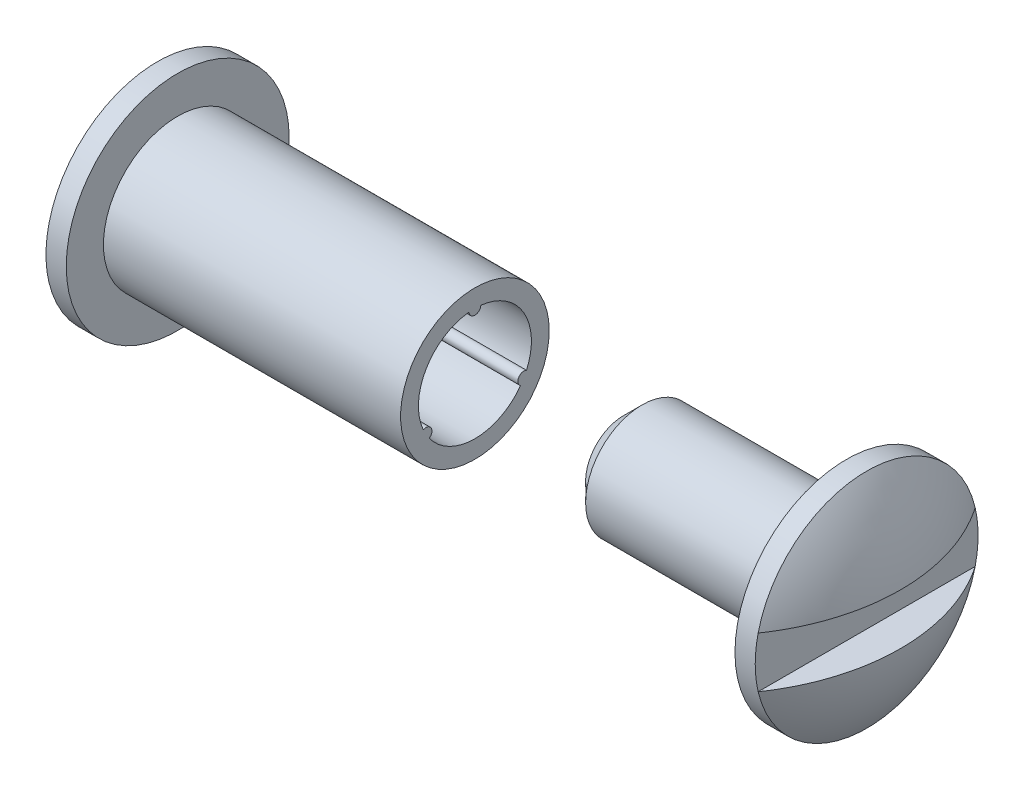
ISO-10303-21;
HEADER;
FILE_DESCRIPTION(('STEP AP214'),'2;1');
FILE_NAME('part.step','',(''),(''),'','','');
FILE_SCHEMA(('AUTOMOTIVE_DESIGN { 1 0 10303 214 1 1 1 1 }'));
ENDSEC;
DATA;
#1=APPLICATION_CONTEXT('core data for automotive mechanical design processes');
#2=APPLICATION_PROTOCOL_DEFINITION('international standard','automotive_design',2000,#1);
#3=PRODUCT_CONTEXT('',#1,'mechanical');
#4=PRODUCT('Part','Part','',(#3));
#5=PRODUCT_RELATED_PRODUCT_CATEGORY('part','',(#4));
#6=PRODUCT_DEFINITION_FORMATION('','',#4);
#7=PRODUCT_DEFINITION_CONTEXT('part definition',#1,'design');
#8=PRODUCT_DEFINITION('design','',#6,#7);
#9=PRODUCT_DEFINITION_SHAPE('','',#8);
#10=(LENGTH_UNIT() NAMED_UNIT(*) SI_UNIT(.MILLI.,.METRE.));
#11=(NAMED_UNIT(*) PLANE_ANGLE_UNIT() SI_UNIT($,.RADIAN.));
#12=(NAMED_UNIT(*) SI_UNIT($,.STERADIAN.) SOLID_ANGLE_UNIT());
#13=UNCERTAINTY_MEASURE_WITH_UNIT(LENGTH_MEASURE(1.E-05),#10,'distance_accuracy_value','');
#14=(GEOMETRIC_REPRESENTATION_CONTEXT(3) GLOBAL_UNCERTAINTY_ASSIGNED_CONTEXT((#13)) GLOBAL_UNIT_ASSIGNED_CONTEXT((#10,
#11,#12)) REPRESENTATION_CONTEXT('',''));
#15=CARTESIAN_POINT('',(0.,0.,0.));
#16=DIRECTION('',(0.,0.,1.));
#17=DIRECTION('',(1.,0.,0.));
#18=AXIS2_PLACEMENT_3D('',#15,#16,#17);
#19=CARTESIAN_POINT('',(9.525,0.,0.));
#20=DIRECTION('',(1.,0.,0.));
#21=DIRECTION('',(0.,0.,-1.));
#22=AXIS2_PLACEMENT_3D('',#19,#20,#21);
#23=PLANE('',#22);
#24=CARTESIAN_POINT('',(9.525,0.,0.));
#25=DIRECTION('',(-1.,0.,0.));
#26=DIRECTION('',(0.,0.,1.));
#27=AXIS2_PLACEMENT_3D('',#24,#25,#26);
#28=CIRCLE('',#27,4.7625);
#29=CARTESIAN_POINT('',(9.525,0.,4.7625));
#30=VERTEX_POINT('',#29);
#31=EDGE_CURVE('E93',#30,#30,#28,.T.);
#32=ORIENTED_EDGE('',*,*,#31,.T.);
#33=EDGE_LOOP('',(#32));
#34=FACE_BOUND('',#33,.T.);
#35=CARTESIAN_POINT('',(9.525,0.,0.));
#36=DIRECTION('',(1.,0.,0.));
#37=DIRECTION('',(0.,0.,-1.));
#38=AXIS2_PLACEMENT_3D('',#35,#36,#37);
#39=CIRCLE('',#38,2.413);
#40=CARTESIAN_POINT('',(9.525,0.,2.413));
#41=VERTEX_POINT('',#40);
#42=EDGE_CURVE('E12',#41,#41,#39,.F.);
#43=ORIENTED_EDGE('',*,*,#42,.F.);
#44=EDGE_LOOP('',(#43));
#45=FACE_BOUND('',#44,.T.);
#46=ADVANCED_FACE('F53',(#34,#45),#23,.F.);
#47=CARTESIAN_POINT('',(3.65979150646579,0.,0.));
#48=DIRECTION('',(-1.,0.,0.));
#49=DIRECTION('',(0.,1.,0.));
#50=AXIS2_PLACEMENT_3D('',#47,#48,#49);
#51=SPHERICAL_SURFACE('',#50,8.24518849353421);
#52=CARTESIAN_POINT('',(10.3904472727273,0.,0.));
#53=DIRECTION('',(-1.,0.,0.));
#54=DIRECTION('',(0.,0.,1.));
#55=AXIS2_PLACEMENT_3D('',#52,#53,#54);
#56=CIRCLE('',#55,4.7625);
#57=CARTESIAN_POINT('',(10.3904472727273,1.08585,4.63706114122943));
#58=VERTEX_POINT('',#57);
#59=CARTESIAN_POINT('',(10.3904472727273,1.08585,-4.63706114122943));
#60=VERTEX_POINT('',#59);
#61=EDGE_CURVE('E87',#58,#60,#56,.T.);
#62=ORIENTED_EDGE('',*,*,#61,.F.);
#63=CARTESIAN_POINT('',(3.65979150646579,1.08585,0.));
#64=DIRECTION('',(0.,1.,0.));
#65=DIRECTION('',(0.,0.,1.));
#66=AXIS2_PLACEMENT_3D('',#63,#64,#65);
#67=CIRCLE('',#66,8.17337525575628);
#68=EDGE_CURVE('E61',#58,#60,#67,.T.);
#69=ORIENTED_EDGE('',*,*,#68,.T.);
#70=EDGE_LOOP('',(#62,#69));
#71=FACE_BOUND('',#70,.T.);
#72=ADVANCED_FACE('F96',(#71),#51,.T.);
#73=CARTESIAN_POINT('',(10.3904472727273,-1.08585,-4.63706114122943));
#74=VERTEX_POINT('',#73);
#75=CARTESIAN_POINT('',(10.3904472727273,-1.08585,4.63706114122943));
#76=VERTEX_POINT('',#75);
#77=EDGE_CURVE('E88',#74,#76,#56,.T.);
#78=ORIENTED_EDGE('',*,*,#77,.F.);
#79=CARTESIAN_POINT('',(3.65979150646579,-1.08585,0.));
#80=DIRECTION('',(0.,-1.,0.));
#81=DIRECTION('',(0.,0.,-1.));
#82=AXIS2_PLACEMENT_3D('',#79,#80,#81);
#83=CIRCLE('',#82,8.17337525575628);
#84=EDGE_CURVE('E97',#74,#76,#83,.T.);
#85=ORIENTED_EDGE('',*,*,#84,.T.);
#86=EDGE_LOOP('',(#78,#85));
#87=FACE_BOUND('',#86,.T.);
#88=ADVANCED_FACE('F55',(#87),#51,.T.);
#89=CARTESIAN_POINT('',(9.525,0.,0.));
#90=DIRECTION('',(-1.,0.,0.));
#91=DIRECTION('',(0.,0.,1.));
#92=AXIS2_PLACEMENT_3D('',#89,#90,#91);
#93=CYLINDRICAL_SURFACE('',#92,4.7625);
#94=ORIENTED_EDGE('',*,*,#31,.F.);
#95=EDGE_LOOP('',(#94));
#96=FACE_BOUND('',#95,.T.);
#97=EDGE_CURVE('E75',#76,#58,#56,.T.);
#98=ORIENTED_EDGE('',*,*,#97,.T.);
#99=ORIENTED_EDGE('',*,*,#61,.T.);
#100=EDGE_CURVE('E68',#60,#74,#56,.T.);
#101=ORIENTED_EDGE('',*,*,#100,.T.);
#102=ORIENTED_EDGE('',*,*,#77,.T.);
#103=EDGE_LOOP('',(#98,#99,#101,#102));
#104=FACE_BOUND('',#103,.T.);
#105=ADVANCED_FACE('F98',(#96,#104),#93,.T.);
#106=CARTESIAN_POINT('',(10.3904472727273,1.08585,4.7625));
#107=DIRECTION('',(0.,1.,0.));
#108=DIRECTION('',(0.,0.,1.));
#109=AXIS2_PLACEMENT_3D('',#106,#107,#108);
#110=PLANE('',#109);
#111=DIRECTION('',(0.,0.,1.));
#112=VECTOR('',#111,1.);
#113=CARTESIAN_POINT('',(10.3904472727273,1.08585,4.7625));
#114=LINE('',#113,#112);
#115=EDGE_CURVE('E83',#60,#58,#114,.T.);
#116=ORIENTED_EDGE('',*,*,#115,.F.);
#117=ORIENTED_EDGE('',*,*,#68,.F.);
#118=EDGE_LOOP('',(#116,#117));
#119=FACE_BOUND('',#118,.T.);
#120=ADVANCED_FACE('F92',(#119),#110,.F.);
#121=CARTESIAN_POINT('',(10.3904472727273,-1.08585,4.7625));
#122=DIRECTION('',(0.,-1.,0.));
#123=DIRECTION('',(0.,0.,-1.));
#124=AXIS2_PLACEMENT_3D('',#121,#122,#123);
#125=PLANE('',#124);
#126=DIRECTION('',(0.,0.,-1.));
#127=VECTOR('',#126,1.);
#128=CARTESIAN_POINT('',(10.3904472727273,-1.08585,4.7625));
#129=LINE('',#128,#127);
#130=EDGE_CURVE('E85',#76,#74,#129,.T.);
#131=ORIENTED_EDGE('',*,*,#130,.F.);
#132=ORIENTED_EDGE('',*,*,#84,.F.);
#133=EDGE_LOOP('',(#131,#132));
#134=FACE_BOUND('',#133,.T.);
#135=ADVANCED_FACE('F115',(#134),#125,.F.);
#136=CARTESIAN_POINT('',(10.3904472727273,-1.08585,4.7625));
#137=DIRECTION('',(1.,0.,0.));
#138=DIRECTION('',(0.,0.,-1.));
#139=AXIS2_PLACEMENT_3D('',#136,#137,#138);
#140=PLANE('',#139);
#141=ORIENTED_EDGE('',*,*,#97,.F.);
#142=ORIENTED_EDGE('',*,*,#130,.T.);
#143=ORIENTED_EDGE('',*,*,#100,.F.);
#144=ORIENTED_EDGE('',*,*,#115,.T.);
#145=EDGE_LOOP('',(#141,#142,#143,#144));
#146=FACE_BOUND('',#145,.T.);
#147=ADVANCED_FACE('F82',(#146),#140,.T.);
#148=CARTESIAN_POINT('',(9.525,0.,0.));
#149=DIRECTION('',(-1.,0.,0.));
#150=DIRECTION('',(0.,0.,1.));
#151=AXIS2_PLACEMENT_3D('',#148,#149,#150);
#152=CYLINDRICAL_SURFACE('',#151,2.413);
#153=CARTESIAN_POINT('',(0.793750000000006,0.,0.));
#154=DIRECTION('',(1.,0.,0.));
#155=DIRECTION('',(0.,0.,-1.));
#156=AXIS2_PLACEMENT_3D('',#153,#154,#155);
#157=CIRCLE('',#156,2.413);
#158=CARTESIAN_POINT('',(0.793750000000006,0.,2.413));
#159=VERTEX_POINT('',#158);
#160=EDGE_CURVE('E143',#159,#159,#157,.T.);
#161=CARTESIAN_POINT('',(0.793750000000006,0.,2.413));
#162=CARTESIAN_POINT('',(0.884700520833339,0.,2.413));
#163=CARTESIAN_POINT('',(0.975651041666672,0.,2.413));
#164=CARTESIAN_POINT('',(1.15755208333334,0.,2.413));
#165=CARTESIAN_POINT('',(1.24850260416667,0.,2.413));
#166=CARTESIAN_POINT('',(1.43040364583334,0.,2.413));
#167=CARTESIAN_POINT('',(1.52135416666667,0.,2.413));
#168=CARTESIAN_POINT('',(1.70325520833334,0.,2.413));
#169=CARTESIAN_POINT('',(1.79420572916667,0.,2.413));
#170=CARTESIAN_POINT('',(1.97610677083334,0.,2.413));
#171=CARTESIAN_POINT('',(2.06705729166667,0.,2.413));
#172=CARTESIAN_POINT('',(2.24895833333334,0.,2.413));
#173=CARTESIAN_POINT('',(2.33990885416667,0.,2.413));
#174=CARTESIAN_POINT('',(2.52180989583334,0.,2.413));
#175=CARTESIAN_POINT('',(2.61276041666667,0.,2.413));
#176=CARTESIAN_POINT('',(2.79466145833334,0.,2.413));
#177=CARTESIAN_POINT('',(2.88561197916667,0.,2.413));
#178=CARTESIAN_POINT('',(3.06751302083334,0.,2.413));
#179=CARTESIAN_POINT('',(3.15846354166667,0.,2.413));
#180=CARTESIAN_POINT('',(3.34036458333334,0.,2.413));
#181=CARTESIAN_POINT('',(3.43131510416667,0.,2.413));
#182=CARTESIAN_POINT('',(3.61321614583334,0.,2.413));
#183=CARTESIAN_POINT('',(3.70416666666667,0.,2.413));
#184=CARTESIAN_POINT('',(3.88606770833334,0.,2.413));
#185=CARTESIAN_POINT('',(3.97701822916667,0.,2.413));
#186=CARTESIAN_POINT('',(4.15891927083334,0.,2.413));
#187=CARTESIAN_POINT('',(4.24986979166667,0.,2.413));
#188=CARTESIAN_POINT('',(4.43177083333334,0.,2.413));
#189=CARTESIAN_POINT('',(4.52272135416667,0.,2.413));
#190=CARTESIAN_POINT('',(4.70462239583334,0.,2.413));
#191=CARTESIAN_POINT('',(4.79557291666667,0.,2.413));
#192=CARTESIAN_POINT('',(4.97747395833334,0.,2.413));
#193=CARTESIAN_POINT('',(5.06842447916667,0.,2.413));
#194=CARTESIAN_POINT('',(5.25032552083334,0.,2.413));
#195=CARTESIAN_POINT('',(5.34127604166667,0.,2.413));
#196=CARTESIAN_POINT('',(5.52317708333334,0.,2.413));
#197=CARTESIAN_POINT('',(5.61412760416667,0.,2.413));
#198=CARTESIAN_POINT('',(5.79602864583334,0.,2.413));
#199=CARTESIAN_POINT('',(5.88697916666667,0.,2.413));
#200=CARTESIAN_POINT('',(6.06888020833333,0.,2.413));
#201=CARTESIAN_POINT('',(6.15983072916667,0.,2.413));
#202=CARTESIAN_POINT('',(6.34173177083334,0.,2.413));
#203=CARTESIAN_POINT('',(6.43268229166667,0.,2.413));
#204=CARTESIAN_POINT('',(6.61458333333333,0.,2.413));
#205=CARTESIAN_POINT('',(6.70553385416667,0.,2.413));
#206=CARTESIAN_POINT('',(6.88743489583334,0.,2.413));
#207=CARTESIAN_POINT('',(6.97838541666667,0.,2.413));
#208=CARTESIAN_POINT('',(7.16028645833333,0.,2.413));
#209=CARTESIAN_POINT('',(7.25123697916667,0.,2.413));
#210=CARTESIAN_POINT('',(7.43313802083333,0.,2.413));
#211=CARTESIAN_POINT('',(7.52408854166667,0.,2.413));
#212=CARTESIAN_POINT('',(7.70598958333333,0.,2.413));
#213=CARTESIAN_POINT('',(7.79694010416667,0.,2.413));
#214=CARTESIAN_POINT('',(7.97884114583333,0.,2.413));
#215=CARTESIAN_POINT('',(8.06979166666667,0.,2.413));
#216=CARTESIAN_POINT('',(8.25169270833333,0.,2.413));
#217=CARTESIAN_POINT('',(8.34264322916667,0.,2.413));
#218=CARTESIAN_POINT('',(8.52454427083333,0.,2.413));
#219=CARTESIAN_POINT('',(8.61549479166667,0.,2.413));
#220=CARTESIAN_POINT('',(8.79739583333333,0.,2.413));
#221=CARTESIAN_POINT('',(8.88834635416667,0.,2.413));
#222=CARTESIAN_POINT('',(9.07024739583333,0.,2.413));
#223=CARTESIAN_POINT('',(9.16119791666667,0.,2.413));
#224=CARTESIAN_POINT('',(9.34309895833333,0.,2.413));
#225=CARTESIAN_POINT('',(9.43404947916667,0.,2.413));
#226=CARTESIAN_POINT('',(9.525,0.,2.413));
#227=B_SPLINE_CURVE_WITH_KNOTS('',3,(#161,#162,#163,#164,#165,#166,#167,#168,#169,#170,#171,
#172,#173,#174,#175,#176,#177,#178,#179,#180,#181,#182,#183,#184,#185,#186,#187,#188,#189,#190,
#191,#192,#193,#194,#195,#196,#197,#198,#199,#200,#201,#202,#203,#204,#205,#206,#207,#208,#209,
#210,#211,#212,#213,#214,#215,#216,#217,#218,#219,#220,#221,#222,#223,#224,#225,#226),
.UNSPECIFIED.,.F.,.F.,(4,2,2,2,2,2,2,2,2,2,2,2,2,2,2,2,2,2,2,2,2,2,2,2,2,2,2,2,2,2,2,2,4),(0.,
0.272851562499999,0.545703125,0.818554687499999,1.09140625,1.3642578125,1.637109375,
1.9099609375,2.1828125,2.4556640625,2.728515625,3.0013671875,3.27421875,3.5470703125,
3.819921875,4.0927734375,4.365625,4.6384765625,4.911328125,5.1841796875,5.45703125,
5.72988281249999,6.002734375,6.27558593749999,6.54843749999999,6.82128906249999,
7.09414062499999,7.36699218749999,7.63984374999999,7.91269531249999,8.18554687499999,
8.45839843749999,8.73124999999999),.UNSPECIFIED.);
#228=EDGE_CURVE('BSEAM127',#159,#41,#227,.T.);
#229=ORIENTED_EDGE('',*,*,#160,.T.);
#230=ORIENTED_EDGE('',*,*,#42,.T.);
#231=ORIENTED_EDGE('',*,*,#228,.T.);
#232=ORIENTED_EDGE('',*,*,#228,.F.);
#233=EDGE_LOOP('',(#229,#231,#230,#232));
#234=FACE_BOUND('',#233,.T.);
#235=ADVANCED_FACE('F127',(#234),#152,.T.);
#236=CARTESIAN_POINT('',(0.,0.,0.));
#237=DIRECTION('',(1.,0.,0.));
#238=DIRECTION('',(0.,0.,-1.));
#239=AXIS2_PLACEMENT_3D('',#236,#237,#238);
#240=PLANE('',#239);
#241=CARTESIAN_POINT('',(0.,0.,0.));
#242=DIRECTION('',(1.,0.,0.));
#243=DIRECTION('',(0.,0.,-1.));
#244=AXIS2_PLACEMENT_3D('',#241,#242,#243);
#245=CIRCLE('',#244,1.61924999999999);
#246=CARTESIAN_POINT('',(0.,0.,-1.61924999999999));
#247=VERTEX_POINT('',#246);
#248=EDGE_CURVE('E142',#247,#247,#245,.F.);
#249=ORIENTED_EDGE('',*,*,#248,.T.);
#250=EDGE_LOOP('',(#249));
#251=FACE_BOUND('',#250,.T.);
#252=ADVANCED_FACE('F131',(#251),#240,.F.);
#253=CARTESIAN_POINT('',(0.793750000000006,0.,0.));
#254=DIRECTION('',(1.,0.,0.));
#255=DIRECTION('',(0.,0.,-1.));
#256=AXIS2_PLACEMENT_3D('',#253,#254,#255);
#257=CONICAL_SURFACE('',#256,2.413,0.785398163397451);
#258=ORIENTED_EDGE('',*,*,#248,.F.);
#259=EDGE_LOOP('',(#258));
#260=FACE_BOUND('',#259,.T.);
#261=ORIENTED_EDGE('',*,*,#160,.F.);
#262=EDGE_LOOP('',(#261));
#263=FACE_BOUND('',#262,.T.);
#264=ADVANCED_FACE('F128',(#260,#263),#257,.T.);
#265=CLOSED_SHELL('',(#46,#72,#88,#105,#120,#135,#147,#235,#252,#264));
#266=MANIFOLD_SOLID_BREP('B2',#265);
#267=CARTESIAN_POINT('',(-28.0302561210692,0.,0.));
#268=DIRECTION('',(1.,0.,0.));
#269=DIRECTION('',(0.,0.,-1.));
#270=AXIS2_PLACEMENT_3D('',#267,#268,#269);
#271=CYLINDRICAL_SURFACE('',#270,3.175);
#272=CARTESIAN_POINT('',(-6.35,0.,0.));
#273=DIRECTION('',(1.,0.,0.));
#274=DIRECTION('',(0.,0.,-1.));
#275=AXIS2_PLACEMENT_3D('',#272,#273,#274);
#276=CIRCLE('',#275,3.175);
#277=CARTESIAN_POINT('',(-6.35,0.,-3.175));
#278=VERTEX_POINT('',#277);
#279=EDGE_CURVE('E313',#278,#278,#276,.T.);
#280=CARTESIAN_POINT('',(-19.05,0.,0.));
#281=DIRECTION('',(-1.,0.,0.));
#282=DIRECTION('',(0.,0.,1.));
#283=AXIS2_PLACEMENT_3D('',#280,#281,#282);
#284=CIRCLE('',#283,3.175);
#285=CARTESIAN_POINT('',(-19.05,0.,-3.175));
#286=VERTEX_POINT('',#285);
#287=EDGE_CURVE('E294',#286,#286,#284,.F.);
#288=CARTESIAN_POINT('',(-6.35,0.,-3.175));
#289=CARTESIAN_POINT('',(-6.48229166666667,0.,-3.175));
#290=CARTESIAN_POINT('',(-6.61458333333333,0.,-3.175));
#291=CARTESIAN_POINT('',(-6.87916666666667,0.,-3.175));
#292=CARTESIAN_POINT('',(-7.01145833333333,0.,-3.175));
#293=CARTESIAN_POINT('',(-7.27604166666666,0.,-3.175));
#294=CARTESIAN_POINT('',(-7.40833333333333,0.,-3.175));
#295=CARTESIAN_POINT('',(-7.67291666666666,0.,-3.175));
#296=CARTESIAN_POINT('',(-7.80520833333333,0.,-3.175));
#297=CARTESIAN_POINT('',(-8.06979166666666,0.,-3.175));
#298=CARTESIAN_POINT('',(-8.20208333333333,0.,-3.175));
#299=CARTESIAN_POINT('',(-8.46666666666667,0.,-3.175));
#300=CARTESIAN_POINT('',(-8.59895833333333,0.,-3.175));
#301=CARTESIAN_POINT('',(-8.86354166666666,0.,-3.175));
#302=CARTESIAN_POINT('',(-8.99583333333333,0.,-3.175));
#303=CARTESIAN_POINT('',(-9.26041666666666,0.,-3.175));
#304=CARTESIAN_POINT('',(-9.39270833333333,0.,-3.175));
#305=CARTESIAN_POINT('',(-9.65729166666666,0.,-3.175));
#306=CARTESIAN_POINT('',(-9.78958333333333,0.,-3.175));
#307=CARTESIAN_POINT('',(-10.0541666666667,0.,-3.175));
#308=CARTESIAN_POINT('',(-10.1864583333333,0.,-3.175));
#309=CARTESIAN_POINT('',(-10.4510416666667,0.,-3.175));
#310=CARTESIAN_POINT('',(-10.5833333333333,0.,-3.175));
#311=CARTESIAN_POINT('',(-10.8479166666667,0.,-3.175));
#312=CARTESIAN_POINT('',(-10.9802083333333,0.,-3.175));
#313=CARTESIAN_POINT('',(-11.2447916666667,0.,-3.175));
#314=CARTESIAN_POINT('',(-11.3770833333333,0.,-3.175));
#315=CARTESIAN_POINT('',(-11.6416666666667,0.,-3.175));
#316=CARTESIAN_POINT('',(-11.7739583333333,0.,-3.175));
#317=CARTESIAN_POINT('',(-12.0385416666667,0.,-3.175));
#318=CARTESIAN_POINT('',(-12.1708333333333,0.,-3.175));
#319=CARTESIAN_POINT('',(-12.4354166666667,0.,-3.175));
#320=CARTESIAN_POINT('',(-12.5677083333333,0.,-3.175));
#321=CARTESIAN_POINT('',(-12.8322916666667,0.,-3.175));
#322=CARTESIAN_POINT('',(-12.9645833333333,0.,-3.175));
#323=CARTESIAN_POINT('',(-13.2291666666667,0.,-3.175));
#324=CARTESIAN_POINT('',(-13.3614583333333,0.,-3.175));
#325=CARTESIAN_POINT('',(-13.6260416666667,0.,-3.175));
#326=CARTESIAN_POINT('',(-13.7583333333333,0.,-3.175));
#327=CARTESIAN_POINT('',(-14.0229166666667,0.,-3.175));
#328=CARTESIAN_POINT('',(-14.1552083333333,0.,-3.175));
#329=CARTESIAN_POINT('',(-14.4197916666667,0.,-3.175));
#330=CARTESIAN_POINT('',(-14.5520833333333,0.,-3.175));
#331=CARTESIAN_POINT('',(-14.8166666666667,0.,-3.175));
#332=CARTESIAN_POINT('',(-14.9489583333333,0.,-3.175));
#333=CARTESIAN_POINT('',(-15.2135416666667,0.,-3.175));
#334=CARTESIAN_POINT('',(-15.3458333333333,0.,-3.175));
#335=CARTESIAN_POINT('',(-15.6104166666667,0.,-3.175));
#336=CARTESIAN_POINT('',(-15.7427083333333,0.,-3.175));
#337=CARTESIAN_POINT('',(-16.0072916666667,0.,-3.175));
#338=CARTESIAN_POINT('',(-16.1395833333333,0.,-3.175));
#339=CARTESIAN_POINT('',(-16.4041666666667,0.,-3.175));
#340=CARTESIAN_POINT('',(-16.5364583333333,0.,-3.175));
#341=CARTESIAN_POINT('',(-16.8010416666667,0.,-3.175));
#342=CARTESIAN_POINT('',(-16.9333333333333,0.,-3.175));
#343=CARTESIAN_POINT('',(-17.1979166666667,0.,-3.175));
#344=CARTESIAN_POINT('',(-17.3302083333333,0.,-3.175));
#345=CARTESIAN_POINT('',(-17.5947916666667,0.,-3.175));
#346=CARTESIAN_POINT('',(-17.7270833333333,0.,-3.175));
#347=CARTESIAN_POINT('',(-17.9916666666667,0.,-3.175));
#348=CARTESIAN_POINT('',(-18.1239583333333,0.,-3.175));
#349=CARTESIAN_POINT('',(-18.3885416666667,0.,-3.175));
#350=CARTESIAN_POINT('',(-18.5208333333333,0.,-3.175));
#351=CARTESIAN_POINT('',(-18.7854166666667,0.,-3.175));
#352=CARTESIAN_POINT('',(-18.9177083333333,0.,-3.175));
#353=CARTESIAN_POINT('',(-19.05,0.,-3.175));
#354=B_SPLINE_CURVE_WITH_KNOTS('',3,(#288,#289,#290,#291,#292,#293,#294,#295,#296,#297,#298,
#299,#300,#301,#302,#303,#304,#305,#306,#307,#308,#309,#310,#311,#312,#313,#314,#315,#316,#317,
#318,#319,#320,#321,#322,#323,#324,#325,#326,#327,#328,#329,#330,#331,#332,#333,#334,#335,#336,
#337,#338,#339,#340,#341,#342,#343,#344,#345,#346,#347,#348,#349,#350,#351,#352,#353),
.UNSPECIFIED.,.F.,.F.,(4,2,2,2,2,2,2,2,2,2,2,2,2,2,2,2,2,2,2,2,2,2,2,2,2,2,2,2,2,2,2,2,4),(0.,
0.396875000000001,0.793749999999999,1.190625,1.5875,1.984375,2.38125,2.778125,3.175,3.571875,
3.96875,4.365625,4.7625,5.159375,5.55625,5.953125,6.35,6.746875,7.14375,7.540625,7.9375,
8.334375,8.73125,9.128125,9.525,9.921875,10.31875,10.715625,11.1125,11.509375,11.90625,
12.303125,12.7),.UNSPECIFIED.);
#355=EDGE_CURVE('BSEAM213',#278,#286,#354,.T.);
#356=ORIENTED_EDGE('',*,*,#279,.F.);
#357=ORIENTED_EDGE('',*,*,#287,.T.);
#358=ORIENTED_EDGE('',*,*,#355,.T.);
#359=ORIENTED_EDGE('',*,*,#355,.F.);
#360=EDGE_LOOP('',(#356,#358,#357,#359));
#361=FACE_BOUND('',#360,.T.);
#362=ADVANCED_FACE('F213',(#361),#271,.T.);
#363=CARTESIAN_POINT('',(-28.0302561210692,2.413,0.));
#364=DIRECTION('',(1.,0.,0.));
#365=DIRECTION('',(0.,0.,-1.));
#366=AXIS2_PLACEMENT_3D('',#363,#364,#365);
#367=CYLINDRICAL_SURFACE('',#366,0.254);
#368=CARTESIAN_POINT('',(-19.05,2.413,0.));
#369=DIRECTION('',(-1.,0.,0.));
#370=DIRECTION('',(0.,0.,1.));
#371=AXIS2_PLACEMENT_3D('',#368,#369,#370);
#372=CIRCLE('',#371,0.254);
#373=CARTESIAN_POINT('',(-19.05,2.39963157894737,-0.253647955478768));
#374=VERTEX_POINT('',#373);
#375=CARTESIAN_POINT('',(-19.05,2.39963157894737,0.253647955478769));
#376=VERTEX_POINT('',#375);
#377=EDGE_CURVE('E287',#374,#376,#372,.T.);
#378=ORIENTED_EDGE('',*,*,#377,.F.);
#379=DIRECTION('',(1.,0.,0.));
#380=VECTOR('',#379,1.);
#381=CARTESIAN_POINT('',(-28.0302561210692,2.39963157894737,-0.253647955478768));
#382=LINE('',#381,#380);
#383=CARTESIAN_POINT('',(-6.35,2.39963157894737,-0.253647955478768));
#384=VERTEX_POINT('',#383);
#385=EDGE_CURVE('E290',#374,#384,#382,.T.);
#386=ORIENTED_EDGE('',*,*,#385,.T.);
#387=CARTESIAN_POINT('',(-6.35,2.413,0.));
#388=DIRECTION('',(-1.,0.,0.));
#389=DIRECTION('',(0.,0.,-1.));
#390=AXIS2_PLACEMENT_3D('',#387,#388,#389);
#391=CIRCLE('',#390,0.254);
#392=CARTESIAN_POINT('',(-6.35,2.39963157894737,0.253647955478769));
#393=VERTEX_POINT('',#392);
#394=EDGE_CURVE('E293',#384,#393,#391,.T.);
#395=ORIENTED_EDGE('',*,*,#394,.T.);
#396=DIRECTION('',(1.,0.,0.));
#397=VECTOR('',#396,1.);
#398=CARTESIAN_POINT('',(-28.0302561210692,2.39963157894737,0.253647955478769));
#399=LINE('',#398,#397);
#400=EDGE_CURVE('E217',#376,#393,#399,.T.);
#401=ORIENTED_EDGE('',*,*,#400,.F.);
#402=EDGE_LOOP('',(#378,#386,#395,#401));
#403=FACE_BOUND('',#402,.T.);
#404=ADVANCED_FACE('F215',(#403),#367,.T.);
#405=CARTESIAN_POINT('',(-28.0302561210692,0.,0.));
#406=DIRECTION('',(1.,0.,0.));
#407=DIRECTION('',(0.,0.,-1.));
#408=AXIS2_PLACEMENT_3D('',#405,#406,#407);
#409=CYLINDRICAL_SURFACE('',#408,2.413);
#410=CARTESIAN_POINT('',(-19.05,0.,0.));
#411=DIRECTION('',(-1.,0.,0.));
#412=DIRECTION('',(0.,0.,1.));
#413=AXIS2_PLACEMENT_3D('',#410,#411,#412);
#414=CIRCLE('',#413,2.413);
#415=CARTESIAN_POINT('',(-19.05,-0.980150216411078,-2.20496588483117));
#416=VERTEX_POINT('',#415);
#417=EDGE_CURVE('E318',#416,#374,#414,.F.);
#418=ORIENTED_EDGE('',*,*,#417,.F.);
#419=DIRECTION('',(1.,0.,0.));
#420=VECTOR('',#419,1.);
#421=CARTESIAN_POINT('',(-28.0302561210692,-0.980150216411078,-2.20496588483117));
#422=LINE('',#421,#420);
#423=CARTESIAN_POINT('',(-6.35,-0.980150216411078,-2.20496588483117));
#424=VERTEX_POINT('',#423);
#425=EDGE_CURVE('E295',#416,#424,#422,.T.);
#426=ORIENTED_EDGE('',*,*,#425,.T.);
#427=CARTESIAN_POINT('',(-6.35,0.,0.));
#428=DIRECTION('',(1.,0.,0.));
#429=DIRECTION('',(0.,0.,-1.));
#430=AXIS2_PLACEMENT_3D('',#427,#428,#429);
#431=CIRCLE('',#430,2.413);
#432=EDGE_CURVE('E298',#424,#384,#431,.T.);
#433=ORIENTED_EDGE('',*,*,#432,.T.);
#434=ORIENTED_EDGE('',*,*,#385,.F.);
#435=EDGE_LOOP('',(#418,#426,#433,#434));
#436=FACE_BOUND('',#435,.T.);
#437=ADVANCED_FACE('F334',(#436),#409,.F.);
#438=CARTESIAN_POINT('',(-28.0302561210692,-1.20649999999999,-2.08971929933185));
#439=DIRECTION('',(1.,0.,0.));
#440=DIRECTION('',(0.,0.,-1.));
#441=AXIS2_PLACEMENT_3D('',#438,#439,#440);
#442=CYLINDRICAL_SURFACE('',#441,0.254);
#443=CARTESIAN_POINT('',(-19.05,-1.20649999999999,-2.08971929933185));
#444=DIRECTION('',(-1.,0.,0.));
#445=DIRECTION('',(0.,0.,1.));
#446=AXIS2_PLACEMENT_3D('',#443,#444,#445);
#447=CIRCLE('',#446,0.254);
#448=CARTESIAN_POINT('',(-19.05,-1.41948136253628,-1.9513179293524));
#449=VERTEX_POINT('',#448);
#450=EDGE_CURVE('E51',#449,#416,#447,.T.);
#451=ORIENTED_EDGE('',*,*,#450,.F.);
#452=DIRECTION('',(1.,0.,0.));
#453=VECTOR('',#452,1.);
#454=CARTESIAN_POINT('',(-28.0302561210692,-1.41948136253628,-1.9513179293524));
#455=LINE('',#454,#453);
#456=CARTESIAN_POINT('',(-6.35,-1.41948136253628,-1.9513179293524));
#457=VERTEX_POINT('',#456);
#458=EDGE_CURVE('E261',#449,#457,#455,.T.);
#459=ORIENTED_EDGE('',*,*,#458,.T.);
#460=CARTESIAN_POINT('',(-6.35,-1.20649999999999,-2.08971929933185));
#461=DIRECTION('',(-1.,0.,0.));
#462=DIRECTION('',(0.,0.,-1.));
#463=AXIS2_PLACEMENT_3D('',#460,#461,#462);
#464=CIRCLE('',#463,0.254);
#465=EDGE_CURVE('E277',#457,#424,#464,.T.);
#466=ORIENTED_EDGE('',*,*,#465,.T.);
#467=ORIENTED_EDGE('',*,*,#425,.F.);
#468=EDGE_LOOP('',(#451,#459,#466,#467));
#469=FACE_BOUND('',#468,.T.);
#470=ADVANCED_FACE('F349',(#469),#442,.T.);
#471=CARTESIAN_POINT('',(-28.0302561210692,0.,0.));
#472=DIRECTION('',(1.,0.,0.));
#473=DIRECTION('',(0.,0.,-1.));
#474=AXIS2_PLACEMENT_3D('',#471,#472,#473);
#475=CYLINDRICAL_SURFACE('',#474,2.413);
#476=CARTESIAN_POINT('',(-19.05,0.,0.));
#477=DIRECTION('',(-1.,0.,0.));
#478=DIRECTION('',(0.,0.,1.));
#479=AXIS2_PLACEMENT_3D('',#476,#477,#478);
#480=CIRCLE('',#479,2.413);
#481=CARTESIAN_POINT('',(-19.05,-1.41948136253628,1.9513179293524));
#482=VERTEX_POINT('',#481);
#483=EDGE_CURVE('E224',#482,#449,#480,.F.);
#484=ORIENTED_EDGE('',*,*,#483,.F.);
#485=DIRECTION('',(1.,0.,0.));
#486=VECTOR('',#485,1.);
#487=CARTESIAN_POINT('',(-28.0302561210692,-1.41948136253628,1.9513179293524));
#488=LINE('',#487,#486);
#489=CARTESIAN_POINT('',(-6.35,-1.41948136253628,1.9513179293524));
#490=VERTEX_POINT('',#489);
#491=EDGE_CURVE('E256',#482,#490,#488,.T.);
#492=ORIENTED_EDGE('',*,*,#491,.T.);
#493=CARTESIAN_POINT('',(-6.35,0.,0.));
#494=DIRECTION('',(1.,0.,0.));
#495=DIRECTION('',(0.,0.,-1.));
#496=AXIS2_PLACEMENT_3D('',#493,#494,#495);
#497=CIRCLE('',#496,2.413);
#498=EDGE_CURVE('E276',#490,#457,#497,.T.);
#499=ORIENTED_EDGE('',*,*,#498,.T.);
#500=ORIENTED_EDGE('',*,*,#458,.F.);
#501=EDGE_LOOP('',(#484,#492,#499,#500));
#502=FACE_BOUND('',#501,.T.);
#503=ADVANCED_FACE('F260',(#502),#475,.F.);
#504=CARTESIAN_POINT('',(-28.0302561210692,-1.20649999999999,2.08971929933185));
#505=DIRECTION('',(1.,0.,0.));
#506=DIRECTION('',(0.,0.,-1.));
#507=AXIS2_PLACEMENT_3D('',#504,#505,#506);
#508=CYLINDRICAL_SURFACE('',#507,0.254);
#509=CARTESIAN_POINT('',(-19.05,-1.20649999999999,2.08971929933185));
#510=DIRECTION('',(-1.,0.,0.));
#511=DIRECTION('',(0.,0.,1.));
#512=AXIS2_PLACEMENT_3D('',#509,#510,#511);
#513=CIRCLE('',#512,0.254);
#514=CARTESIAN_POINT('',(-19.05,-0.980150216411079,2.20496588483117));
#515=VERTEX_POINT('',#514);
#516=EDGE_CURVE('E265',#515,#482,#513,.T.);
#517=ORIENTED_EDGE('',*,*,#516,.F.);
#518=DIRECTION('',(1.,0.,0.));
#519=VECTOR('',#518,1.);
#520=CARTESIAN_POINT('',(-28.0302561210692,-0.980150216411079,2.20496588483117));
#521=LINE('',#520,#519);
#522=CARTESIAN_POINT('',(-6.35,-0.980150216411079,2.20496588483117));
#523=VERTEX_POINT('',#522);
#524=EDGE_CURVE('E300',#515,#523,#521,.T.);
#525=ORIENTED_EDGE('',*,*,#524,.T.);
#526=CARTESIAN_POINT('',(-6.35,-1.20649999999999,2.08971929933185));
#527=DIRECTION('',(-1.,0.,0.));
#528=DIRECTION('',(0.,0.,-1.));
#529=AXIS2_PLACEMENT_3D('',#526,#527,#528);
#530=CIRCLE('',#529,0.254);
#531=EDGE_CURVE('E273',#523,#490,#530,.T.);
#532=ORIENTED_EDGE('',*,*,#531,.T.);
#533=ORIENTED_EDGE('',*,*,#491,.F.);
#534=EDGE_LOOP('',(#517,#525,#532,#533));
#535=FACE_BOUND('',#534,.T.);
#536=ADVANCED_FACE('F269',(#535),#508,.T.);
#537=CARTESIAN_POINT('',(-28.0302561210692,0.,0.));
#538=DIRECTION('',(1.,0.,0.));
#539=DIRECTION('',(0.,0.,-1.));
#540=AXIS2_PLACEMENT_3D('',#537,#538,#539);
#541=CYLINDRICAL_SURFACE('',#540,2.413);
#542=CARTESIAN_POINT('',(-19.05,0.,0.));
#543=DIRECTION('',(-1.,0.,0.));
#544=DIRECTION('',(0.,0.,1.));
#545=AXIS2_PLACEMENT_3D('',#542,#543,#544);
#546=CIRCLE('',#545,2.413);
#547=EDGE_CURVE('E283',#376,#515,#546,.F.);
#548=ORIENTED_EDGE('',*,*,#547,.F.);
#549=ORIENTED_EDGE('',*,*,#400,.T.);
#550=CARTESIAN_POINT('',(-6.35,0.,0.));
#551=DIRECTION('',(1.,0.,0.));
#552=DIRECTION('',(0.,0.,-1.));
#553=AXIS2_PLACEMENT_3D('',#550,#551,#552);
#554=CIRCLE('',#553,2.413);
#555=EDGE_CURVE('E310',#393,#523,#554,.T.);
#556=ORIENTED_EDGE('',*,*,#555,.T.);
#557=ORIENTED_EDGE('',*,*,#524,.F.);
#558=EDGE_LOOP('',(#548,#549,#556,#557));
#559=FACE_BOUND('',#558,.T.);
#560=ADVANCED_FACE('F368',(#559),#541,.F.);
#561=CARTESIAN_POINT('',(-6.35,0.,0.));
#562=DIRECTION('',(1.,0.,0.));
#563=DIRECTION('',(0.,0.,-1.));
#564=AXIS2_PLACEMENT_3D('',#561,#562,#563);
#565=PLANE('',#564);
#566=ORIENTED_EDGE('',*,*,#394,.F.);
#567=ORIENTED_EDGE('',*,*,#432,.F.);
#568=ORIENTED_EDGE('',*,*,#465,.F.);
#569=ORIENTED_EDGE('',*,*,#498,.F.);
#570=ORIENTED_EDGE('',*,*,#531,.F.);
#571=ORIENTED_EDGE('',*,*,#555,.F.);
#572=EDGE_LOOP('',(#566,#567,#568,#569,#570,#571));
#573=FACE_BOUND('',#572,.T.);
#574=ORIENTED_EDGE('',*,*,#279,.T.);
#575=EDGE_LOOP('',(#574));
#576=FACE_BOUND('',#575,.T.);
#577=ADVANCED_FACE('F339',(#573,#576),#565,.T.);
#578=CARTESIAN_POINT('',(-19.05,0.,0.));
#579=DIRECTION('',(-1.,0.,0.));
#580=DIRECTION('',(0.,0.,-1.));
#581=AXIS2_PLACEMENT_3D('',#578,#579,#580);
#582=PLANE('',#581);
#583=ORIENTED_EDGE('',*,*,#417,.T.);
#584=ORIENTED_EDGE('',*,*,#377,.T.);
#585=ORIENTED_EDGE('',*,*,#547,.T.);
#586=ORIENTED_EDGE('',*,*,#516,.T.);
#587=ORIENTED_EDGE('',*,*,#483,.T.);
#588=ORIENTED_EDGE('',*,*,#450,.T.);
#589=EDGE_LOOP('',(#583,#584,#585,#586,#587,#588));
#590=FACE_BOUND('',#589,.T.);
#591=ADVANCED_FACE('F281',(#590),#582,.F.);
#592=CARTESIAN_POINT('',(-13.1847915064658,0.,0.));
#593=DIRECTION('',(1.,0.,0.));
#594=DIRECTION('',(0.,1.,0.));
#595=AXIS2_PLACEMENT_3D('',#592,#593,#594);
#596=SPHERICAL_SURFACE('',#595,8.24518849353421);
#597=CARTESIAN_POINT('',(-19.9154472727273,0.,0.));
#598=DIRECTION('',(-1.,0.,0.));
#599=DIRECTION('',(0.,0.,1.));
#600=AXIS2_PLACEMENT_3D('',#597,#598,#599);
#601=CIRCLE('',#600,4.7625);
#602=CARTESIAN_POINT('',(-19.9154472727273,1.08585,4.63706114122943));
#603=VERTEX_POINT('',#602);
#604=CARTESIAN_POINT('',(-19.9154472727273,1.08585,-4.63706114122943));
#605=VERTEX_POINT('',#604);
#606=EDGE_CURVE('E535',#603,#605,#601,.T.);
#607=ORIENTED_EDGE('',*,*,#606,.T.);
#608=CARTESIAN_POINT('',(-13.1847915064658,1.08585,0.));
#609=DIRECTION('',(0.,-1.,0.));
#610=DIRECTION('',(0.,0.,1.));
#611=AXIS2_PLACEMENT_3D('',#608,#609,#610);
#612=CIRCLE('',#611,8.17337525575628);
#613=EDGE_CURVE('E540',#603,#605,#612,.T.);
#614=ORIENTED_EDGE('',*,*,#613,.F.);
#615=EDGE_LOOP('',(#607,#614));
#616=FACE_BOUND('',#615,.T.);
#617=ADVANCED_FACE('F392',(#616),#596,.T.);
#618=CARTESIAN_POINT('',(-19.9154472727273,-1.08585,-4.63706114122943));
#619=VERTEX_POINT('',#618);
#620=CARTESIAN_POINT('',(-19.9154472727273,-1.08585,4.63706114122943));
#621=VERTEX_POINT('',#620);
#622=EDGE_CURVE('E537',#619,#621,#601,.T.);
#623=ORIENTED_EDGE('',*,*,#622,.T.);
#624=CARTESIAN_POINT('',(-13.1847915064658,-1.08585,0.));
#625=DIRECTION('',(0.,1.,0.));
#626=DIRECTION('',(0.,0.,-1.));
#627=AXIS2_PLACEMENT_3D('',#624,#625,#626);
#628=CIRCLE('',#627,8.17337525575628);
#629=EDGE_CURVE('E534',#619,#621,#628,.T.);
#630=ORIENTED_EDGE('',*,*,#629,.F.);
#631=EDGE_LOOP('',(#623,#630));
#632=FACE_BOUND('',#631,.T.);
#633=ADVANCED_FACE('F399',(#632),#596,.T.);
#634=CARTESIAN_POINT('',(-19.05,0.,0.));
#635=DIRECTION('',(1.,0.,0.));
#636=DIRECTION('',(0.,0.,1.));
#637=AXIS2_PLACEMENT_3D('',#634,#635,#636);
#638=CYLINDRICAL_SURFACE('',#637,4.7625);
#639=CARTESIAN_POINT('',(-19.05,0.,0.));
#640=DIRECTION('',(-1.,0.,0.));
#641=DIRECTION('',(0.,0.,1.));
#642=AXIS2_PLACEMENT_3D('',#639,#640,#641);
#643=CIRCLE('',#642,4.7625);
#644=CARTESIAN_POINT('',(-19.05,0.,4.7625));
#645=VERTEX_POINT('',#644);
#646=EDGE_CURVE('E547',#645,#645,#643,.T.);
#647=ORIENTED_EDGE('',*,*,#646,.T.);
#648=EDGE_LOOP('',(#647));
#649=FACE_BOUND('',#648,.T.);
#650=EDGE_CURVE('E518',#621,#603,#601,.T.);
#651=ORIENTED_EDGE('',*,*,#650,.F.);
#652=ORIENTED_EDGE('',*,*,#622,.F.);
#653=EDGE_CURVE('E542',#605,#619,#601,.T.);
#654=ORIENTED_EDGE('',*,*,#653,.F.);
#655=ORIENTED_EDGE('',*,*,#606,.F.);
#656=EDGE_LOOP('',(#651,#652,#654,#655));
#657=FACE_BOUND('',#656,.T.);
#658=ADVANCED_FACE('F406',(#649,#657),#638,.T.);
#659=ORIENTED_EDGE('',*,*,#287,.F.);
#660=EDGE_LOOP('',(#659));
#661=FACE_BOUND('',#660,.T.);
#662=ORIENTED_EDGE('',*,*,#646,.F.);
#663=EDGE_LOOP('',(#662));
#664=FACE_BOUND('',#663,.T.);
#665=ADVANCED_FACE('F394',(#661,#664),#582,.F.);
#666=CARTESIAN_POINT('',(-19.9154472727273,1.08585,4.7625));
#667=DIRECTION('',(0.,1.,0.));
#668=DIRECTION('',(0.,0.,1.));
#669=AXIS2_PLACEMENT_3D('',#666,#667,#668);
#670=PLANE('',#669);
#671=DIRECTION('',(0.,0.,1.));
#672=VECTOR('',#671,1.);
#673=CARTESIAN_POINT('',(-19.9154472727273,1.08585,4.7625));
#674=LINE('',#673,#672);
#675=EDGE_CURVE('E523',#605,#603,#674,.T.);
#676=ORIENTED_EDGE('',*,*,#675,.T.);
#677=ORIENTED_EDGE('',*,*,#613,.T.);
#678=EDGE_LOOP('',(#676,#677));
#679=FACE_BOUND('',#678,.T.);
#680=ADVANCED_FACE('F419',(#679),#670,.F.);
#681=CARTESIAN_POINT('',(-19.9154472727273,-1.08585,4.7625));
#682=DIRECTION('',(0.,-1.,0.));
#683=DIRECTION('',(0.,0.,-1.));
#684=AXIS2_PLACEMENT_3D('',#681,#682,#683);
#685=PLANE('',#684);
#686=DIRECTION('',(0.,0.,-1.));
#687=VECTOR('',#686,1.);
#688=CARTESIAN_POINT('',(-19.9154472727273,-1.08585,4.7625));
#689=LINE('',#688,#687);
#690=EDGE_CURVE('E527',#621,#619,#689,.T.);
#691=ORIENTED_EDGE('',*,*,#690,.T.);
#692=ORIENTED_EDGE('',*,*,#629,.T.);
#693=EDGE_LOOP('',(#691,#692));
#694=FACE_BOUND('',#693,.T.);
#695=ADVANCED_FACE('F427',(#694),#685,.F.);
#696=CARTESIAN_POINT('',(-19.9154472727273,-1.08585,4.7625));
#697=DIRECTION('',(-1.,0.,0.));
#698=DIRECTION('',(0.,0.,-1.));
#699=AXIS2_PLACEMENT_3D('',#696,#697,#698);
#700=PLANE('',#699);
#701=ORIENTED_EDGE('',*,*,#650,.T.);
#702=ORIENTED_EDGE('',*,*,#675,.F.);
#703=ORIENTED_EDGE('',*,*,#653,.T.);
#704=ORIENTED_EDGE('',*,*,#690,.F.);
#705=EDGE_LOOP('',(#701,#702,#703,#704));
#706=FACE_BOUND('',#705,.T.);
#707=ADVANCED_FACE('F434',(#706),#700,.T.);
#708=CLOSED_SHELL('',(#362,#404,#437,#470,#503,#536,#560,#577,#591,#617,#633,#658,#665,#680,
#695,#707));
#709=MANIFOLD_SOLID_BREP('B6',#708);
#710=ADVANCED_BREP_SHAPE_REPRESENTATION('',(#18,#266,#709),#14);
#711=SHAPE_DEFINITION_REPRESENTATION(#9,#710);
ENDSEC;
END-ISO-10303-21;
